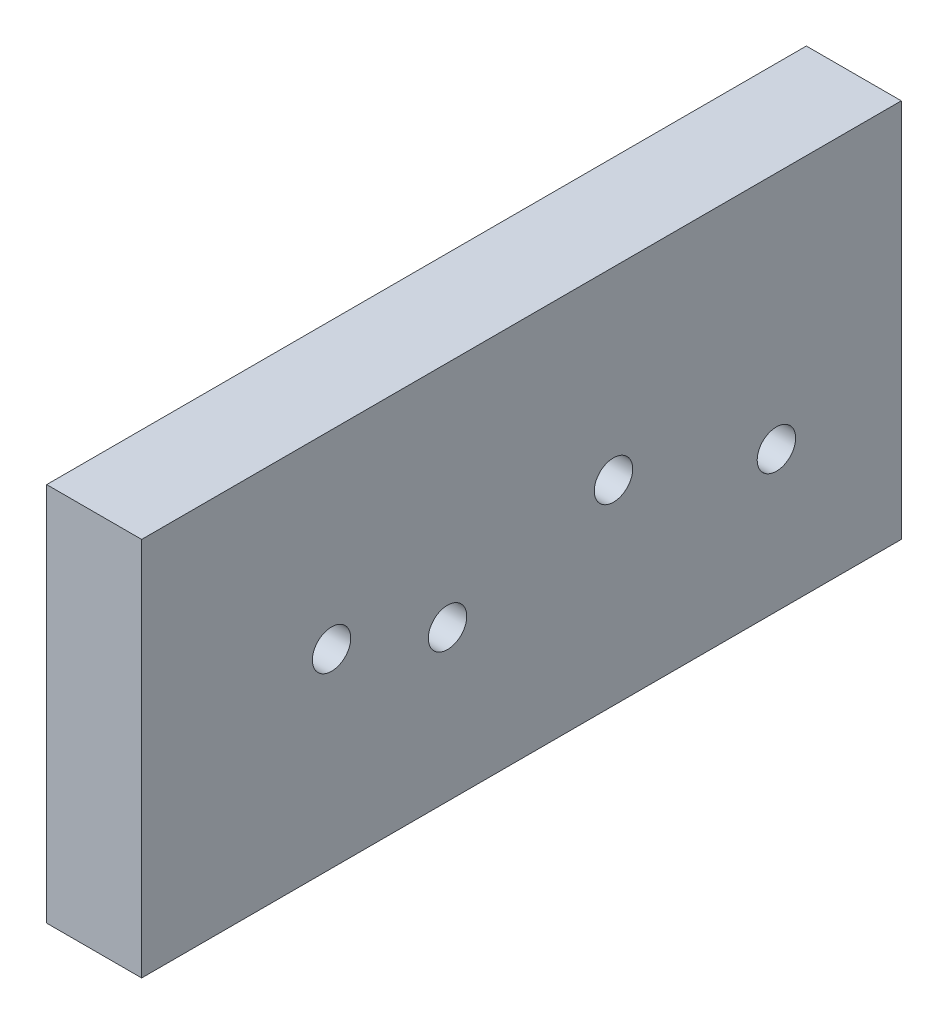
ISO-10303-21;
HEADER;
FILE_DESCRIPTION(('STEP AP214'),'2;1');
FILE_NAME('part.step','',(''),(''),'','','');
FILE_SCHEMA(('AUTOMOTIVE_DESIGN { 1 0 10303 214 1 1 1 1 }'));
ENDSEC;
DATA;
#1=APPLICATION_CONTEXT('core data for automotive mechanical design processes');
#2=APPLICATION_PROTOCOL_DEFINITION('international standard','automotive_design',2000,#1);
#3=PRODUCT_CONTEXT('',#1,'mechanical');
#4=PRODUCT('Part','Part','',(#3));
#5=PRODUCT_RELATED_PRODUCT_CATEGORY('part','',(#4));
#6=PRODUCT_DEFINITION_FORMATION('','',#4);
#7=PRODUCT_DEFINITION_CONTEXT('part definition',#1,'design');
#8=PRODUCT_DEFINITION('design','',#6,#7);
#9=PRODUCT_DEFINITION_SHAPE('','',#8);
#10=(LENGTH_UNIT() NAMED_UNIT(*) SI_UNIT(.MILLI.,.METRE.));
#11=(NAMED_UNIT(*) PLANE_ANGLE_UNIT() SI_UNIT($,.RADIAN.));
#12=(NAMED_UNIT(*) SI_UNIT($,.STERADIAN.) SOLID_ANGLE_UNIT());
#13=UNCERTAINTY_MEASURE_WITH_UNIT(LENGTH_MEASURE(1.E-05),#10,'distance_accuracy_value','');
#14=(GEOMETRIC_REPRESENTATION_CONTEXT(3) GLOBAL_UNCERTAINTY_ASSIGNED_CONTEXT((#13)) GLOBAL_UNIT_ASSIGNED_CONTEXT((#10,
#11,#12)) REPRESENTATION_CONTEXT('',''));
#15=CARTESIAN_POINT('',(0.,0.,0.));
#16=DIRECTION('',(0.,0.,1.));
#17=DIRECTION('',(1.,0.,0.));
#18=AXIS2_PLACEMENT_3D('',#15,#16,#17);
#19=CARTESIAN_POINT('',(19.05,-9.873506971,-51.1434579937716));
#20=DIRECTION('',(-1.,0.,0.));
#21=DIRECTION('',(0.,0.,1.));
#22=AXIS2_PLACEMENT_3D('',#19,#20,#21);
#23=CYLINDRICAL_SURFACE('',#22,3.85455777521835);
#24=CARTESIAN_POINT('',(19.05,-9.873506971,-51.1434579937716));
#25=DIRECTION('',(1.,0.,0.));
#26=DIRECTION('',(0.,0.,-1.));
#27=AXIS2_PLACEMENT_3D('',#24,#25,#26);
#28=CIRCLE('',#27,3.85455777521835);
#29=CARTESIAN_POINT('',(19.05,-9.873506971,-47.2889002185533));
#30=VERTEX_POINT('',#29);
#31=EDGE_CURVE('E165',#30,#30,#28,.T.);
#32=CARTESIAN_POINT('',(6.35,-9.873506971,-51.1434579937716));
#33=DIRECTION('',(-1.,0.,0.));
#34=DIRECTION('',(0.,0.,1.));
#35=AXIS2_PLACEMENT_3D('',#32,#33,#34);
#36=CIRCLE('',#35,3.85455777521835);
#37=CARTESIAN_POINT('',(6.35,-9.873506971,-47.2889002185533));
#38=VERTEX_POINT('',#37);
#39=EDGE_CURVE('E55',#38,#38,#36,.T.);
#40=CARTESIAN_POINT('',(19.05,-9.873506971,-47.2889002185533));
#41=CARTESIAN_POINT('',(18.9177083333333,-9.873506971,-47.2889002185533));
#42=CARTESIAN_POINT('',(18.7854166666667,-9.873506971,-47.2889002185533));
#43=CARTESIAN_POINT('',(18.5208333333333,-9.873506971,-47.2889002185533));
#44=CARTESIAN_POINT('',(18.3885416666667,-9.873506971,-47.2889002185533));
#45=CARTESIAN_POINT('',(18.1239583333333,-9.873506971,-47.2889002185533));
#46=CARTESIAN_POINT('',(17.9916666666667,-9.873506971,-47.2889002185533));
#47=CARTESIAN_POINT('',(17.7270833333333,-9.873506971,-47.2889002185533));
#48=CARTESIAN_POINT('',(17.5947916666667,-9.873506971,-47.2889002185533));
#49=CARTESIAN_POINT('',(17.3302083333333,-9.873506971,-47.2889002185533));
#50=CARTESIAN_POINT('',(17.1979166666667,-9.873506971,-47.2889002185533));
#51=CARTESIAN_POINT('',(16.9333333333333,-9.873506971,-47.2889002185533));
#52=CARTESIAN_POINT('',(16.8010416666667,-9.873506971,-47.2889002185533));
#53=CARTESIAN_POINT('',(16.5364583333333,-9.873506971,-47.2889002185533));
#54=CARTESIAN_POINT('',(16.4041666666667,-9.873506971,-47.2889002185533));
#55=CARTESIAN_POINT('',(16.1395833333333,-9.873506971,-47.2889002185533));
#56=CARTESIAN_POINT('',(16.0072916666667,-9.873506971,-47.2889002185533));
#57=CARTESIAN_POINT('',(15.7427083333333,-9.873506971,-47.2889002185533));
#58=CARTESIAN_POINT('',(15.6104166666667,-9.873506971,-47.2889002185533));
#59=CARTESIAN_POINT('',(15.3458333333333,-9.873506971,-47.2889002185533));
#60=CARTESIAN_POINT('',(15.2135416666667,-9.873506971,-47.2889002185533));
#61=CARTESIAN_POINT('',(14.9489583333333,-9.873506971,-47.2889002185533));
#62=CARTESIAN_POINT('',(14.8166666666667,-9.873506971,-47.2889002185533));
#63=CARTESIAN_POINT('',(14.5520833333333,-9.873506971,-47.2889002185533));
#64=CARTESIAN_POINT('',(14.4197916666667,-9.873506971,-47.2889002185533));
#65=CARTESIAN_POINT('',(14.1552083333333,-9.873506971,-47.2889002185533));
#66=CARTESIAN_POINT('',(14.0229166666667,-9.873506971,-47.2889002185533));
#67=CARTESIAN_POINT('',(13.7583333333333,-9.873506971,-47.2889002185533));
#68=CARTESIAN_POINT('',(13.6260416666667,-9.873506971,-47.2889002185533));
#69=CARTESIAN_POINT('',(13.3614583333333,-9.873506971,-47.2889002185533));
#70=CARTESIAN_POINT('',(13.2291666666667,-9.873506971,-47.2889002185533));
#71=CARTESIAN_POINT('',(12.9645833333333,-9.873506971,-47.2889002185533));
#72=CARTESIAN_POINT('',(12.8322916666667,-9.873506971,-47.2889002185533));
#73=CARTESIAN_POINT('',(12.5677083333333,-9.873506971,-47.2889002185533));
#74=CARTESIAN_POINT('',(12.4354166666667,-9.873506971,-47.2889002185533));
#75=CARTESIAN_POINT('',(12.1708333333333,-9.873506971,-47.2889002185533));
#76=CARTESIAN_POINT('',(12.0385416666667,-9.873506971,-47.2889002185533));
#77=CARTESIAN_POINT('',(11.7739583333333,-9.873506971,-47.2889002185533));
#78=CARTESIAN_POINT('',(11.6416666666667,-9.873506971,-47.2889002185533));
#79=CARTESIAN_POINT('',(11.3770833333333,-9.873506971,-47.2889002185533));
#80=CARTESIAN_POINT('',(11.2447916666667,-9.873506971,-47.2889002185533));
#81=CARTESIAN_POINT('',(10.9802083333333,-9.873506971,-47.2889002185533));
#82=CARTESIAN_POINT('',(10.8479166666667,-9.873506971,-47.2889002185533));
#83=CARTESIAN_POINT('',(10.5833333333333,-9.873506971,-47.2889002185533));
#84=CARTESIAN_POINT('',(10.4510416666667,-9.873506971,-47.2889002185533));
#85=CARTESIAN_POINT('',(10.1864583333333,-9.873506971,-47.2889002185533));
#86=CARTESIAN_POINT('',(10.0541666666667,-9.873506971,-47.2889002185533));
#87=CARTESIAN_POINT('',(9.78958333333333,-9.873506971,-47.2889002185533));
#88=CARTESIAN_POINT('',(9.65729166666667,-9.873506971,-47.2889002185533));
#89=CARTESIAN_POINT('',(9.39270833333333,-9.873506971,-47.2889002185533));
#90=CARTESIAN_POINT('',(9.26041666666667,-9.873506971,-47.2889002185533));
#91=CARTESIAN_POINT('',(8.99583333333333,-9.873506971,-47.2889002185533));
#92=CARTESIAN_POINT('',(8.86354166666667,-9.873506971,-47.2889002185533));
#93=CARTESIAN_POINT('',(8.59895833333333,-9.873506971,-47.2889002185533));
#94=CARTESIAN_POINT('',(8.46666666666667,-9.873506971,-47.2889002185533));
#95=CARTESIAN_POINT('',(8.20208333333333,-9.873506971,-47.2889002185533));
#96=CARTESIAN_POINT('',(8.06979166666667,-9.873506971,-47.2889002185533));
#97=CARTESIAN_POINT('',(7.80520833333333,-9.873506971,-47.2889002185533));
#98=CARTESIAN_POINT('',(7.67291666666667,-9.873506971,-47.2889002185533));
#99=CARTESIAN_POINT('',(7.40833333333333,-9.873506971,-47.2889002185533));
#100=CARTESIAN_POINT('',(7.27604166666667,-9.873506971,-47.2889002185533));
#101=CARTESIAN_POINT('',(7.01145833333333,-9.873506971,-47.2889002185533));
#102=CARTESIAN_POINT('',(6.87916666666667,-9.873506971,-47.2889002185533));
#103=CARTESIAN_POINT('',(6.61458333333333,-9.873506971,-47.2889002185533));
#104=CARTESIAN_POINT('',(6.48229166666667,-9.873506971,-47.2889002185533));
#105=CARTESIAN_POINT('',(6.35,-9.873506971,-47.2889002185533));
#106=B_SPLINE_CURVE_WITH_KNOTS('',3,(#40,#41,#42,#43,#44,#45,#46,#47,#48,#49,#50,#51,#52,#53,
#54,#55,#56,#57,#58,#59,#60,#61,#62,#63,#64,#65,#66,#67,#68,#69,#70,#71,#72,#73,#74,#75,#76,#77,
#78,#79,#80,#81,#82,#83,#84,#85,#86,#87,#88,#89,#90,#91,#92,#93,#94,#95,#96,#97,#98,#99,#100,
#101,#102,#103,#104,#105),.UNSPECIFIED.,.F.,.F.,(4,2,2,2,2,2,2,2,2,2,2,2,2,2,2,2,2,2,2,2,2,2,2,
2,2,2,2,2,2,2,2,2,4),(0.,0.396875000000001,0.793750000000003,1.190625,1.5875,1.984375,2.38125,
2.778125,3.175,3.571875,3.96875,4.365625,4.7625,5.159375,5.55625,5.953125,6.35,6.746875,7.14375,
7.540625,7.9375,8.334375,8.73125,9.128125,9.525,9.921875,10.31875,10.715625,11.1125,11.509375,
11.90625,12.303125,12.7),.UNSPECIFIED.);
#107=EDGE_CURVE('BSEAM51',#30,#38,#106,.T.);
#108=ORIENTED_EDGE('',*,*,#31,.T.);
#109=ORIENTED_EDGE('',*,*,#39,.T.);
#110=ORIENTED_EDGE('',*,*,#107,.T.);
#111=ORIENTED_EDGE('',*,*,#107,.F.);
#112=EDGE_LOOP('',(#108,#110,#109,#111));
#113=FACE_BOUND('',#112,.T.);
#114=ADVANCED_FACE('F51',(#113),#23,.F.);
#115=CARTESIAN_POINT('',(19.05,1.096077429,-18.4577335821185));
#116=DIRECTION('',(-1.,0.,0.));
#117=DIRECTION('',(0.,0.,1.));
#118=AXIS2_PLACEMENT_3D('',#115,#116,#117);
#119=CYLINDRICAL_SURFACE('',#118,3.85455777521835);
#120=CARTESIAN_POINT('',(19.05,1.096077429,-18.4577335821185));
#121=DIRECTION('',(1.,0.,0.));
#122=DIRECTION('',(0.,0.,-1.));
#123=AXIS2_PLACEMENT_3D('',#120,#121,#122);
#124=CIRCLE('',#123,3.85455777521835);
#125=CARTESIAN_POINT('',(19.05,1.096077429,-14.6031758069001));
#126=VERTEX_POINT('',#125);
#127=EDGE_CURVE('E161',#126,#126,#124,.T.);
#128=CARTESIAN_POINT('',(6.35,1.096077429,-18.4577335821185));
#129=DIRECTION('',(-1.,0.,0.));
#130=DIRECTION('',(0.,0.,1.));
#131=AXIS2_PLACEMENT_3D('',#128,#129,#130);
#132=CIRCLE('',#131,3.85455777521835);
#133=CARTESIAN_POINT('',(6.35,1.096077429,-14.6031758069001));
#134=VERTEX_POINT('',#133);
#135=EDGE_CURVE('E200',#134,#134,#132,.T.);
#136=CARTESIAN_POINT('',(19.05,1.096077429,-14.6031758069001));
#137=CARTESIAN_POINT('',(18.9177083333333,1.096077429,-14.6031758069001));
#138=CARTESIAN_POINT('',(18.7854166666667,1.096077429,-14.6031758069001));
#139=CARTESIAN_POINT('',(18.5208333333333,1.096077429,-14.6031758069001));
#140=CARTESIAN_POINT('',(18.3885416666667,1.096077429,-14.6031758069001));
#141=CARTESIAN_POINT('',(18.1239583333333,1.096077429,-14.6031758069001));
#142=CARTESIAN_POINT('',(17.9916666666667,1.096077429,-14.6031758069001));
#143=CARTESIAN_POINT('',(17.7270833333333,1.096077429,-14.6031758069001));
#144=CARTESIAN_POINT('',(17.5947916666667,1.096077429,-14.6031758069001));
#145=CARTESIAN_POINT('',(17.3302083333333,1.096077429,-14.6031758069001));
#146=CARTESIAN_POINT('',(17.1979166666667,1.096077429,-14.6031758069001));
#147=CARTESIAN_POINT('',(16.9333333333333,1.096077429,-14.6031758069001));
#148=CARTESIAN_POINT('',(16.8010416666667,1.096077429,-14.6031758069001));
#149=CARTESIAN_POINT('',(16.5364583333333,1.096077429,-14.6031758069001));
#150=CARTESIAN_POINT('',(16.4041666666667,1.096077429,-14.6031758069001));
#151=CARTESIAN_POINT('',(16.1395833333333,1.096077429,-14.6031758069001));
#152=CARTESIAN_POINT('',(16.0072916666667,1.096077429,-14.6031758069001));
#153=CARTESIAN_POINT('',(15.7427083333333,1.096077429,-14.6031758069001));
#154=CARTESIAN_POINT('',(15.6104166666667,1.096077429,-14.6031758069001));
#155=CARTESIAN_POINT('',(15.3458333333333,1.096077429,-14.6031758069001));
#156=CARTESIAN_POINT('',(15.2135416666667,1.096077429,-14.6031758069001));
#157=CARTESIAN_POINT('',(14.9489583333333,1.096077429,-14.6031758069001));
#158=CARTESIAN_POINT('',(14.8166666666667,1.096077429,-14.6031758069001));
#159=CARTESIAN_POINT('',(14.5520833333333,1.096077429,-14.6031758069001));
#160=CARTESIAN_POINT('',(14.4197916666667,1.096077429,-14.6031758069001));
#161=CARTESIAN_POINT('',(14.1552083333333,1.096077429,-14.6031758069001));
#162=CARTESIAN_POINT('',(14.0229166666667,1.096077429,-14.6031758069001));
#163=CARTESIAN_POINT('',(13.7583333333333,1.096077429,-14.6031758069001));
#164=CARTESIAN_POINT('',(13.6260416666667,1.096077429,-14.6031758069001));
#165=CARTESIAN_POINT('',(13.3614583333333,1.096077429,-14.6031758069001));
#166=CARTESIAN_POINT('',(13.2291666666667,1.096077429,-14.6031758069001));
#167=CARTESIAN_POINT('',(12.9645833333333,1.096077429,-14.6031758069001));
#168=CARTESIAN_POINT('',(12.8322916666667,1.096077429,-14.6031758069001));
#169=CARTESIAN_POINT('',(12.5677083333333,1.096077429,-14.6031758069001));
#170=CARTESIAN_POINT('',(12.4354166666667,1.096077429,-14.6031758069001));
#171=CARTESIAN_POINT('',(12.1708333333333,1.096077429,-14.6031758069001));
#172=CARTESIAN_POINT('',(12.0385416666667,1.096077429,-14.6031758069001));
#173=CARTESIAN_POINT('',(11.7739583333333,1.096077429,-14.6031758069001));
#174=CARTESIAN_POINT('',(11.6416666666667,1.096077429,-14.6031758069001));
#175=CARTESIAN_POINT('',(11.3770833333333,1.096077429,-14.6031758069001));
#176=CARTESIAN_POINT('',(11.2447916666667,1.096077429,-14.6031758069001));
#177=CARTESIAN_POINT('',(10.9802083333333,1.096077429,-14.6031758069001));
#178=CARTESIAN_POINT('',(10.8479166666667,1.096077429,-14.6031758069001));
#179=CARTESIAN_POINT('',(10.5833333333333,1.096077429,-14.6031758069001));
#180=CARTESIAN_POINT('',(10.4510416666667,1.096077429,-14.6031758069001));
#181=CARTESIAN_POINT('',(10.1864583333333,1.096077429,-14.6031758069001));
#182=CARTESIAN_POINT('',(10.0541666666667,1.096077429,-14.6031758069001));
#183=CARTESIAN_POINT('',(9.78958333333333,1.096077429,-14.6031758069001));
#184=CARTESIAN_POINT('',(9.65729166666667,1.096077429,-14.6031758069001));
#185=CARTESIAN_POINT('',(9.39270833333333,1.096077429,-14.6031758069001));
#186=CARTESIAN_POINT('',(9.26041666666667,1.096077429,-14.6031758069001));
#187=CARTESIAN_POINT('',(8.99583333333333,1.096077429,-14.6031758069001));
#188=CARTESIAN_POINT('',(8.86354166666667,1.096077429,-14.6031758069001));
#189=CARTESIAN_POINT('',(8.59895833333333,1.096077429,-14.6031758069001));
#190=CARTESIAN_POINT('',(8.46666666666667,1.096077429,-14.6031758069001));
#191=CARTESIAN_POINT('',(8.20208333333333,1.096077429,-14.6031758069001));
#192=CARTESIAN_POINT('',(8.06979166666667,1.096077429,-14.6031758069001));
#193=CARTESIAN_POINT('',(7.80520833333333,1.096077429,-14.6031758069001));
#194=CARTESIAN_POINT('',(7.67291666666667,1.096077429,-14.6031758069001));
#195=CARTESIAN_POINT('',(7.40833333333333,1.096077429,-14.6031758069001));
#196=CARTESIAN_POINT('',(7.27604166666667,1.096077429,-14.6031758069001));
#197=CARTESIAN_POINT('',(7.01145833333333,1.096077429,-14.6031758069001));
#198=CARTESIAN_POINT('',(6.87916666666667,1.096077429,-14.6031758069001));
#199=CARTESIAN_POINT('',(6.61458333333333,1.096077429,-14.6031758069001));
#200=CARTESIAN_POINT('',(6.48229166666667,1.096077429,-14.6031758069001));
#201=CARTESIAN_POINT('',(6.35,1.096077429,-14.6031758069001));
#202=B_SPLINE_CURVE_WITH_KNOTS('',3,(#136,#137,#138,#139,#140,#141,#142,#143,#144,#145,#146,
#147,#148,#149,#150,#151,#152,#153,#154,#155,#156,#157,#158,#159,#160,#161,#162,#163,#164,#165,
#166,#167,#168,#169,#170,#171,#172,#173,#174,#175,#176,#177,#178,#179,#180,#181,#182,#183,#184,
#185,#186,#187,#188,#189,#190,#191,#192,#193,#194,#195,#196,#197,#198,#199,#200,#201),
.UNSPECIFIED.,.F.,.F.,(4,2,2,2,2,2,2,2,2,2,2,2,2,2,2,2,2,2,2,2,2,2,2,2,2,2,2,2,2,2,2,2,4),(0.,
0.396875000000001,0.793750000000003,1.190625,1.5875,1.984375,2.38125,2.778125,3.175,3.571875,
3.96875,4.365625,4.7625,5.159375,5.55625,5.953125,6.35,6.746875,7.14375,7.540625,7.9375,
8.334375,8.73125,9.128125,9.525,9.921875,10.31875,10.715625,11.1125,11.509375,11.90625,
12.303125,12.7),.UNSPECIFIED.);
#203=EDGE_CURVE('BSEAM286',#126,#134,#202,.T.);
#204=ORIENTED_EDGE('',*,*,#127,.T.);
#205=ORIENTED_EDGE('',*,*,#135,.T.);
#206=ORIENTED_EDGE('',*,*,#203,.T.);
#207=ORIENTED_EDGE('',*,*,#203,.F.);
#208=EDGE_LOOP('',(#204,#206,#205,#207));
#209=FACE_BOUND('',#208,.T.);
#210=ADVANCED_FACE('F286',(#209),#119,.F.);
#211=CARTESIAN_POINT('',(19.05,0.,38.1));
#212=DIRECTION('',(-1.,0.,0.));
#213=DIRECTION('',(0.,0.,1.));
#214=AXIS2_PLACEMENT_3D('',#211,#212,#213);
#215=CYLINDRICAL_SURFACE('',#214,3.85455777521835);
#216=CARTESIAN_POINT('',(19.05,0.,38.1));
#217=DIRECTION('',(1.,0.,0.));
#218=DIRECTION('',(0.,0.,-1.));
#219=AXIS2_PLACEMENT_3D('',#216,#217,#218);
#220=CIRCLE('',#219,3.85455777521835);
#221=CARTESIAN_POINT('',(19.05,0.,41.9545577752184));
#222=VERTEX_POINT('',#221);
#223=EDGE_CURVE('E157',#222,#222,#220,.T.);
#224=CARTESIAN_POINT('',(6.35,0.,38.1));
#225=DIRECTION('',(-1.,0.,0.));
#226=DIRECTION('',(0.,0.,1.));
#227=AXIS2_PLACEMENT_3D('',#224,#225,#226);
#228=CIRCLE('',#227,3.85455777521835);
#229=CARTESIAN_POINT('',(6.35,0.,41.9545577752184));
#230=VERTEX_POINT('',#229);
#231=EDGE_CURVE('E196',#230,#230,#228,.T.);
#232=CARTESIAN_POINT('',(19.05,0.,41.9545577752184));
#233=CARTESIAN_POINT('',(18.9177083333333,0.,41.9545577752184));
#234=CARTESIAN_POINT('',(18.7854166666667,0.,41.9545577752184));
#235=CARTESIAN_POINT('',(18.5208333333333,0.,41.9545577752184));
#236=CARTESIAN_POINT('',(18.3885416666667,0.,41.9545577752184));
#237=CARTESIAN_POINT('',(18.1239583333333,0.,41.9545577752184));
#238=CARTESIAN_POINT('',(17.9916666666667,0.,41.9545577752184));
#239=CARTESIAN_POINT('',(17.7270833333333,0.,41.9545577752184));
#240=CARTESIAN_POINT('',(17.5947916666667,0.,41.9545577752184));
#241=CARTESIAN_POINT('',(17.3302083333333,0.,41.9545577752184));
#242=CARTESIAN_POINT('',(17.1979166666667,0.,41.9545577752184));
#243=CARTESIAN_POINT('',(16.9333333333333,0.,41.9545577752184));
#244=CARTESIAN_POINT('',(16.8010416666667,0.,41.9545577752184));
#245=CARTESIAN_POINT('',(16.5364583333333,0.,41.9545577752184));
#246=CARTESIAN_POINT('',(16.4041666666667,0.,41.9545577752184));
#247=CARTESIAN_POINT('',(16.1395833333333,0.,41.9545577752184));
#248=CARTESIAN_POINT('',(16.0072916666667,0.,41.9545577752184));
#249=CARTESIAN_POINT('',(15.7427083333333,0.,41.9545577752184));
#250=CARTESIAN_POINT('',(15.6104166666667,0.,41.9545577752184));
#251=CARTESIAN_POINT('',(15.3458333333333,0.,41.9545577752184));
#252=CARTESIAN_POINT('',(15.2135416666667,0.,41.9545577752184));
#253=CARTESIAN_POINT('',(14.9489583333333,0.,41.9545577752184));
#254=CARTESIAN_POINT('',(14.8166666666667,0.,41.9545577752184));
#255=CARTESIAN_POINT('',(14.5520833333333,0.,41.9545577752184));
#256=CARTESIAN_POINT('',(14.4197916666667,0.,41.9545577752184));
#257=CARTESIAN_POINT('',(14.1552083333333,0.,41.9545577752184));
#258=CARTESIAN_POINT('',(14.0229166666667,0.,41.9545577752184));
#259=CARTESIAN_POINT('',(13.7583333333333,0.,41.9545577752184));
#260=CARTESIAN_POINT('',(13.6260416666667,0.,41.9545577752184));
#261=CARTESIAN_POINT('',(13.3614583333333,0.,41.9545577752184));
#262=CARTESIAN_POINT('',(13.2291666666667,0.,41.9545577752184));
#263=CARTESIAN_POINT('',(12.9645833333333,0.,41.9545577752184));
#264=CARTESIAN_POINT('',(12.8322916666667,0.,41.9545577752184));
#265=CARTESIAN_POINT('',(12.5677083333333,0.,41.9545577752184));
#266=CARTESIAN_POINT('',(12.4354166666667,0.,41.9545577752184));
#267=CARTESIAN_POINT('',(12.1708333333333,0.,41.9545577752184));
#268=CARTESIAN_POINT('',(12.0385416666667,0.,41.9545577752184));
#269=CARTESIAN_POINT('',(11.7739583333333,0.,41.9545577752184));
#270=CARTESIAN_POINT('',(11.6416666666667,0.,41.9545577752184));
#271=CARTESIAN_POINT('',(11.3770833333333,0.,41.9545577752184));
#272=CARTESIAN_POINT('',(11.2447916666667,0.,41.9545577752184));
#273=CARTESIAN_POINT('',(10.9802083333333,0.,41.9545577752184));
#274=CARTESIAN_POINT('',(10.8479166666667,0.,41.9545577752184));
#275=CARTESIAN_POINT('',(10.5833333333333,0.,41.9545577752184));
#276=CARTESIAN_POINT('',(10.4510416666667,0.,41.9545577752184));
#277=CARTESIAN_POINT('',(10.1864583333333,0.,41.9545577752184));
#278=CARTESIAN_POINT('',(10.0541666666667,0.,41.9545577752184));
#279=CARTESIAN_POINT('',(9.78958333333333,0.,41.9545577752184));
#280=CARTESIAN_POINT('',(9.65729166666667,0.,41.9545577752184));
#281=CARTESIAN_POINT('',(9.39270833333333,0.,41.9545577752184));
#282=CARTESIAN_POINT('',(9.26041666666667,0.,41.9545577752184));
#283=CARTESIAN_POINT('',(8.99583333333333,0.,41.9545577752184));
#284=CARTESIAN_POINT('',(8.86354166666667,0.,41.9545577752184));
#285=CARTESIAN_POINT('',(8.59895833333333,0.,41.9545577752184));
#286=CARTESIAN_POINT('',(8.46666666666667,0.,41.9545577752184));
#287=CARTESIAN_POINT('',(8.20208333333333,0.,41.9545577752184));
#288=CARTESIAN_POINT('',(8.06979166666667,0.,41.9545577752184));
#289=CARTESIAN_POINT('',(7.80520833333333,0.,41.9545577752184));
#290=CARTESIAN_POINT('',(7.67291666666667,0.,41.9545577752184));
#291=CARTESIAN_POINT('',(7.40833333333333,0.,41.9545577752184));
#292=CARTESIAN_POINT('',(7.27604166666667,0.,41.9545577752184));
#293=CARTESIAN_POINT('',(7.01145833333333,0.,41.9545577752184));
#294=CARTESIAN_POINT('',(6.87916666666667,0.,41.9545577752184));
#295=CARTESIAN_POINT('',(6.61458333333333,0.,41.9545577752184));
#296=CARTESIAN_POINT('',(6.48229166666667,0.,41.9545577752184));
#297=CARTESIAN_POINT('',(6.35,0.,41.9545577752184));
#298=B_SPLINE_CURVE_WITH_KNOTS('',3,(#232,#233,#234,#235,#236,#237,#238,#239,#240,#241,#242,
#243,#244,#245,#246,#247,#248,#249,#250,#251,#252,#253,#254,#255,#256,#257,#258,#259,#260,#261,
#262,#263,#264,#265,#266,#267,#268,#269,#270,#271,#272,#273,#274,#275,#276,#277,#278,#279,#280,
#281,#282,#283,#284,#285,#286,#287,#288,#289,#290,#291,#292,#293,#294,#295,#296,#297),
.UNSPECIFIED.,.F.,.F.,(4,2,2,2,2,2,2,2,2,2,2,2,2,2,2,2,2,2,2,2,2,2,2,2,2,2,2,2,2,2,2,2,4),(0.,
0.396875000000001,0.793750000000003,1.190625,1.5875,1.984375,2.38125,2.778125,3.175,3.571875,
3.96875,4.365625,4.7625,5.159375,5.55625,5.953125,6.35,6.746875,7.14375,7.540625,7.9375,
8.334375,8.73125,9.128125,9.525,9.921875,10.31875,10.715625,11.1125,11.509375,11.90625,
12.303125,12.7),.UNSPECIFIED.);
#299=EDGE_CURVE('BSEAM293',#222,#230,#298,.T.);
#300=ORIENTED_EDGE('',*,*,#223,.T.);
#301=ORIENTED_EDGE('',*,*,#231,.T.);
#302=ORIENTED_EDGE('',*,*,#299,.T.);
#303=ORIENTED_EDGE('',*,*,#299,.F.);
#304=EDGE_LOOP('',(#300,#302,#301,#303));
#305=FACE_BOUND('',#304,.T.);
#306=ADVANCED_FACE('F293',(#305),#215,.F.);
#307=CARTESIAN_POINT('',(19.05,-7.860160654,14.8360220129459));
#308=DIRECTION('',(-1.,0.,0.));
#309=DIRECTION('',(0.,0.,1.));
#310=AXIS2_PLACEMENT_3D('',#307,#308,#309);
#311=CYLINDRICAL_SURFACE('',#310,3.85455777521835);
#312=CARTESIAN_POINT('',(19.05,-7.860160654,14.8360220129459));
#313=DIRECTION('',(1.,0.,0.));
#314=DIRECTION('',(0.,0.,-1.));
#315=AXIS2_PLACEMENT_3D('',#312,#313,#314);
#316=CIRCLE('',#315,3.85455777521835);
#317=CARTESIAN_POINT('',(19.05,-7.860160654,18.6905797881643));
#318=VERTEX_POINT('',#317);
#319=EDGE_CURVE('E169',#318,#318,#316,.T.);
#320=CARTESIAN_POINT('',(6.35,-7.860160654,14.8360220129459));
#321=DIRECTION('',(-1.,0.,0.));
#322=DIRECTION('',(0.,0.,1.));
#323=AXIS2_PLACEMENT_3D('',#320,#321,#322);
#324=CIRCLE('',#323,3.85455777521835);
#325=CARTESIAN_POINT('',(6.35,-7.860160654,18.6905797881643));
#326=VERTEX_POINT('',#325);
#327=EDGE_CURVE('E192',#326,#326,#324,.T.);
#328=CARTESIAN_POINT('',(19.05,-7.860160654,18.6905797881643));
#329=CARTESIAN_POINT('',(18.9177083333333,-7.860160654,18.6905797881643));
#330=CARTESIAN_POINT('',(18.7854166666667,-7.860160654,18.6905797881643));
#331=CARTESIAN_POINT('',(18.5208333333333,-7.860160654,18.6905797881643));
#332=CARTESIAN_POINT('',(18.3885416666667,-7.860160654,18.6905797881643));
#333=CARTESIAN_POINT('',(18.1239583333333,-7.860160654,18.6905797881643));
#334=CARTESIAN_POINT('',(17.9916666666667,-7.860160654,18.6905797881643));
#335=CARTESIAN_POINT('',(17.7270833333333,-7.860160654,18.6905797881643));
#336=CARTESIAN_POINT('',(17.5947916666667,-7.860160654,18.6905797881643));
#337=CARTESIAN_POINT('',(17.3302083333333,-7.860160654,18.6905797881643));
#338=CARTESIAN_POINT('',(17.1979166666667,-7.860160654,18.6905797881643));
#339=CARTESIAN_POINT('',(16.9333333333333,-7.860160654,18.6905797881643));
#340=CARTESIAN_POINT('',(16.8010416666667,-7.860160654,18.6905797881643));
#341=CARTESIAN_POINT('',(16.5364583333333,-7.860160654,18.6905797881643));
#342=CARTESIAN_POINT('',(16.4041666666667,-7.860160654,18.6905797881643));
#343=CARTESIAN_POINT('',(16.1395833333333,-7.860160654,18.6905797881643));
#344=CARTESIAN_POINT('',(16.0072916666667,-7.860160654,18.6905797881643));
#345=CARTESIAN_POINT('',(15.7427083333333,-7.860160654,18.6905797881643));
#346=CARTESIAN_POINT('',(15.6104166666667,-7.860160654,18.6905797881643));
#347=CARTESIAN_POINT('',(15.3458333333333,-7.860160654,18.6905797881643));
#348=CARTESIAN_POINT('',(15.2135416666667,-7.860160654,18.6905797881643));
#349=CARTESIAN_POINT('',(14.9489583333333,-7.860160654,18.6905797881643));
#350=CARTESIAN_POINT('',(14.8166666666667,-7.860160654,18.6905797881643));
#351=CARTESIAN_POINT('',(14.5520833333333,-7.860160654,18.6905797881643));
#352=CARTESIAN_POINT('',(14.4197916666667,-7.860160654,18.6905797881643));
#353=CARTESIAN_POINT('',(14.1552083333333,-7.860160654,18.6905797881643));
#354=CARTESIAN_POINT('',(14.0229166666667,-7.860160654,18.6905797881643));
#355=CARTESIAN_POINT('',(13.7583333333333,-7.860160654,18.6905797881643));
#356=CARTESIAN_POINT('',(13.6260416666667,-7.860160654,18.6905797881643));
#357=CARTESIAN_POINT('',(13.3614583333333,-7.860160654,18.6905797881643));
#358=CARTESIAN_POINT('',(13.2291666666667,-7.860160654,18.6905797881643));
#359=CARTESIAN_POINT('',(12.9645833333333,-7.860160654,18.6905797881643));
#360=CARTESIAN_POINT('',(12.8322916666667,-7.860160654,18.6905797881643));
#361=CARTESIAN_POINT('',(12.5677083333333,-7.860160654,18.6905797881643));
#362=CARTESIAN_POINT('',(12.4354166666667,-7.860160654,18.6905797881643));
#363=CARTESIAN_POINT('',(12.1708333333333,-7.860160654,18.6905797881643));
#364=CARTESIAN_POINT('',(12.0385416666667,-7.860160654,18.6905797881643));
#365=CARTESIAN_POINT('',(11.7739583333333,-7.860160654,18.6905797881643));
#366=CARTESIAN_POINT('',(11.6416666666667,-7.860160654,18.6905797881643));
#367=CARTESIAN_POINT('',(11.3770833333333,-7.860160654,18.6905797881643));
#368=CARTESIAN_POINT('',(11.2447916666667,-7.860160654,18.6905797881643));
#369=CARTESIAN_POINT('',(10.9802083333333,-7.860160654,18.6905797881643));
#370=CARTESIAN_POINT('',(10.8479166666667,-7.860160654,18.6905797881643));
#371=CARTESIAN_POINT('',(10.5833333333333,-7.860160654,18.6905797881643));
#372=CARTESIAN_POINT('',(10.4510416666667,-7.860160654,18.6905797881643));
#373=CARTESIAN_POINT('',(10.1864583333333,-7.860160654,18.6905797881643));
#374=CARTESIAN_POINT('',(10.0541666666667,-7.860160654,18.6905797881643));
#375=CARTESIAN_POINT('',(9.78958333333333,-7.860160654,18.6905797881643));
#376=CARTESIAN_POINT('',(9.65729166666667,-7.860160654,18.6905797881643));
#377=CARTESIAN_POINT('',(9.39270833333333,-7.860160654,18.6905797881643));
#378=CARTESIAN_POINT('',(9.26041666666667,-7.860160654,18.6905797881643));
#379=CARTESIAN_POINT('',(8.99583333333333,-7.860160654,18.6905797881643));
#380=CARTESIAN_POINT('',(8.86354166666667,-7.860160654,18.6905797881643));
#381=CARTESIAN_POINT('',(8.59895833333333,-7.860160654,18.6905797881643));
#382=CARTESIAN_POINT('',(8.46666666666667,-7.860160654,18.6905797881643));
#383=CARTESIAN_POINT('',(8.20208333333333,-7.860160654,18.6905797881643));
#384=CARTESIAN_POINT('',(8.06979166666667,-7.860160654,18.6905797881643));
#385=CARTESIAN_POINT('',(7.80520833333333,-7.860160654,18.6905797881643));
#386=CARTESIAN_POINT('',(7.67291666666667,-7.860160654,18.6905797881643));
#387=CARTESIAN_POINT('',(7.40833333333333,-7.860160654,18.6905797881643));
#388=CARTESIAN_POINT('',(7.27604166666667,-7.860160654,18.6905797881643));
#389=CARTESIAN_POINT('',(7.01145833333333,-7.860160654,18.6905797881643));
#390=CARTESIAN_POINT('',(6.87916666666667,-7.860160654,18.6905797881643));
#391=CARTESIAN_POINT('',(6.61458333333333,-7.860160654,18.6905797881643));
#392=CARTESIAN_POINT('',(6.48229166666667,-7.860160654,18.6905797881643));
#393=CARTESIAN_POINT('',(6.35,-7.860160654,18.6905797881643));
#394=B_SPLINE_CURVE_WITH_KNOTS('',3,(#328,#329,#330,#331,#332,#333,#334,#335,#336,#337,#338,
#339,#340,#341,#342,#343,#344,#345,#346,#347,#348,#349,#350,#351,#352,#353,#354,#355,#356,#357,
#358,#359,#360,#361,#362,#363,#364,#365,#366,#367,#368,#369,#370,#371,#372,#373,#374,#375,#376,
#377,#378,#379,#380,#381,#382,#383,#384,#385,#386,#387,#388,#389,#390,#391,#392,#393),
.UNSPECIFIED.,.F.,.F.,(4,2,2,2,2,2,2,2,2,2,2,2,2,2,2,2,2,2,2,2,2,2,2,2,2,2,2,2,2,2,2,2,4),(0.,
0.396875000000001,0.793750000000003,1.190625,1.5875,1.984375,2.38125,2.778125,3.175,3.571875,
3.96875,4.365625,4.7625,5.159375,5.55625,5.953125,6.35,6.746875,7.14375,7.540625,7.9375,
8.334375,8.73125,9.128125,9.525,9.921875,10.31875,10.715625,11.1125,11.509375,11.90625,
12.303125,12.7),.UNSPECIFIED.);
#395=EDGE_CURVE('BSEAM297',#318,#326,#394,.T.);
#396=ORIENTED_EDGE('',*,*,#319,.T.);
#397=ORIENTED_EDGE('',*,*,#327,.T.);
#398=ORIENTED_EDGE('',*,*,#395,.T.);
#399=ORIENTED_EDGE('',*,*,#395,.F.);
#400=EDGE_LOOP('',(#396,#398,#397,#399));
#401=FACE_BOUND('',#400,.T.);
#402=ADVANCED_FACE('F297',(#401),#311,.F.);
#403=CARTESIAN_POINT('',(19.05,-38.1,0.));
#404=DIRECTION('',(0.,1.,0.));
#405=DIRECTION('',(0.,0.,1.));
#406=AXIS2_PLACEMENT_3D('',#403,#404,#405);
#407=PLANE('',#406);
#408=CARTESIAN_POINT('',(9.52500000000002,-38.1,-63.5));
#409=DIRECTION('',(0.,-1.,0.));
#410=DIRECTION('',(0.,0.,-1.));
#411=AXIS2_PLACEMENT_3D('',#408,#409,#410);
#412=CIRCLE('',#411,3.17499999999999);
#413=CARTESIAN_POINT('',(9.52500000000002,-38.1,-66.675));
#414=VERTEX_POINT('',#413);
#415=EDGE_CURVE('E121',#414,#414,#412,.T.);
#416=ORIENTED_EDGE('',*,*,#415,.F.);
#417=EDGE_LOOP('',(#416));
#418=FACE_BOUND('',#417,.T.);
#419=CARTESIAN_POINT('',(9.525,-38.1,0.));
#420=DIRECTION('',(0.,-1.,0.));
#421=DIRECTION('',(0.,0.,-1.));
#422=AXIS2_PLACEMENT_3D('',#419,#420,#421);
#423=CIRCLE('',#422,3.17499999999999);
#424=CARTESIAN_POINT('',(9.525,-38.1,-3.17499999999997));
#425=VERTEX_POINT('',#424);
#426=EDGE_CURVE('E120',#425,#425,#423,.T.);
#427=ORIENTED_EDGE('',*,*,#426,.F.);
#428=EDGE_LOOP('',(#427));
#429=FACE_BOUND('',#428,.T.);
#430=CARTESIAN_POINT('',(9.525,-38.1,57.15));
#431=DIRECTION('',(0.,-1.,0.));
#432=DIRECTION('',(0.,0.,-1.));
#433=AXIS2_PLACEMENT_3D('',#430,#431,#432);
#434=CIRCLE('',#433,3.17499999999999);
#435=CARTESIAN_POINT('',(9.525,-38.1,53.975));
#436=VERTEX_POINT('',#435);
#437=EDGE_CURVE('E135',#436,#436,#434,.T.);
#438=ORIENTED_EDGE('',*,*,#437,.F.);
#439=EDGE_LOOP('',(#438));
#440=FACE_BOUND('',#439,.T.);
#441=DIRECTION('',(0.,0.,-1.));
#442=VECTOR('',#441,1.);
#443=CARTESIAN_POINT('',(0.,-38.1,0.));
#444=LINE('',#443,#442);
#445=CARTESIAN_POINT('',(0.,-38.1,76.2));
#446=VERTEX_POINT('',#445);
#447=CARTESIAN_POINT('',(0.,-38.1,-76.2));
#448=VERTEX_POINT('',#447);
#449=EDGE_CURVE('E143',#446,#448,#444,.T.);
#450=ORIENTED_EDGE('',*,*,#449,.T.);
#451=DIRECTION('',(-1.,0.,0.));
#452=VECTOR('',#451,1.);
#453=CARTESIAN_POINT('',(19.05,-38.1,-76.2));
#454=LINE('',#453,#452);
#455=CARTESIAN_POINT('',(19.05,-38.1,-76.2));
#456=VERTEX_POINT('',#455);
#457=EDGE_CURVE('E11',#456,#448,#454,.T.);
#458=ORIENTED_EDGE('',*,*,#457,.F.);
#459=DIRECTION('',(0.,0.,-1.));
#460=VECTOR('',#459,1.);
#461=CARTESIAN_POINT('',(19.05,-38.1,0.));
#462=LINE('',#461,#460);
#463=CARTESIAN_POINT('',(19.05,-38.1,76.2));
#464=VERTEX_POINT('',#463);
#465=EDGE_CURVE('E144',#464,#456,#462,.T.);
#466=ORIENTED_EDGE('',*,*,#465,.F.);
#467=DIRECTION('',(-1.,0.,0.));
#468=VECTOR('',#467,1.);
#469=CARTESIAN_POINT('',(19.05,-38.1,76.2));
#470=LINE('',#469,#468);
#471=EDGE_CURVE('E71',#464,#446,#470,.T.);
#472=ORIENTED_EDGE('',*,*,#471,.T.);
#473=EDGE_LOOP('',(#450,#458,#466,#472));
#474=FACE_BOUND('',#473,.T.);
#475=ADVANCED_FACE('F53',(#418,#429,#440,#474),#407,.F.);
#476=CARTESIAN_POINT('',(19.05,0.,-76.2));
#477=DIRECTION('',(0.,0.,1.));
#478=DIRECTION('',(1.,0.,0.));
#479=AXIS2_PLACEMENT_3D('',#476,#477,#478);
#480=PLANE('',#479);
#481=DIRECTION('',(0.,1.,0.));
#482=VECTOR('',#481,1.);
#483=CARTESIAN_POINT('',(0.,0.,-76.2));
#484=LINE('',#483,#482);
#485=CARTESIAN_POINT('',(0.,38.1,-76.2));
#486=VERTEX_POINT('',#485);
#487=EDGE_CURVE('E175',#448,#486,#484,.T.);
#488=ORIENTED_EDGE('',*,*,#487,.T.);
#489=DIRECTION('',(-1.,0.,0.));
#490=VECTOR('',#489,1.);
#491=CARTESIAN_POINT('',(19.05,38.1,-76.2));
#492=LINE('',#491,#490);
#493=CARTESIAN_POINT('',(19.05,38.1,-76.2));
#494=VERTEX_POINT('',#493);
#495=EDGE_CURVE('E62',#494,#486,#492,.T.);
#496=ORIENTED_EDGE('',*,*,#495,.F.);
#497=DIRECTION('',(0.,1.,0.));
#498=VECTOR('',#497,1.);
#499=CARTESIAN_POINT('',(19.05,0.,-76.2));
#500=LINE('',#499,#498);
#501=EDGE_CURVE('E98',#456,#494,#500,.T.);
#502=ORIENTED_EDGE('',*,*,#501,.F.);
#503=ORIENTED_EDGE('',*,*,#457,.T.);
#504=EDGE_LOOP('',(#488,#496,#502,#503));
#505=FACE_BOUND('',#504,.T.);
#506=ADVANCED_FACE('F281',(#505),#480,.F.);
#507=CARTESIAN_POINT('',(19.05,38.1,0.));
#508=DIRECTION('',(0.,1.,0.));
#509=DIRECTION('',(0.,0.,1.));
#510=AXIS2_PLACEMENT_3D('',#507,#508,#509);
#511=PLANE('',#510);
#512=DIRECTION('',(0.,0.,-1.));
#513=VECTOR('',#512,1.);
#514=CARTESIAN_POINT('',(0.,38.1,0.));
#515=LINE('',#514,#513);
#516=CARTESIAN_POINT('',(0.,38.1,76.2));
#517=VERTEX_POINT('',#516);
#518=EDGE_CURVE('E179',#517,#486,#515,.T.);
#519=ORIENTED_EDGE('',*,*,#518,.F.);
#520=DIRECTION('',(-1.,0.,0.));
#521=VECTOR('',#520,1.);
#522=CARTESIAN_POINT('',(19.05,38.1,76.2));
#523=LINE('',#522,#521);
#524=CARTESIAN_POINT('',(19.05,38.1,76.2));
#525=VERTEX_POINT('',#524);
#526=EDGE_CURVE('E87',#525,#517,#523,.T.);
#527=ORIENTED_EDGE('',*,*,#526,.F.);
#528=DIRECTION('',(0.,0.,-1.));
#529=VECTOR('',#528,1.);
#530=CARTESIAN_POINT('',(19.05,38.1,0.));
#531=LINE('',#530,#529);
#532=EDGE_CURVE('E150',#525,#494,#531,.T.);
#533=ORIENTED_EDGE('',*,*,#532,.T.);
#534=ORIENTED_EDGE('',*,*,#495,.T.);
#535=EDGE_LOOP('',(#519,#527,#533,#534));
#536=FACE_BOUND('',#535,.T.);
#537=ADVANCED_FACE('F274',(#536),#511,.T.);
#538=CARTESIAN_POINT('',(19.05,0.,76.2));
#539=DIRECTION('',(0.,0.,1.));
#540=DIRECTION('',(1.,0.,0.));
#541=AXIS2_PLACEMENT_3D('',#538,#539,#540);
#542=PLANE('',#541);
#543=DIRECTION('',(0.,1.,0.));
#544=VECTOR('',#543,1.);
#545=CARTESIAN_POINT('',(0.,0.,76.2));
#546=LINE('',#545,#544);
#547=EDGE_CURVE('E147',#446,#517,#546,.T.);
#548=ORIENTED_EDGE('',*,*,#547,.F.);
#549=ORIENTED_EDGE('',*,*,#471,.F.);
#550=DIRECTION('',(0.,1.,0.));
#551=VECTOR('',#550,1.);
#552=CARTESIAN_POINT('',(19.05,0.,76.2));
#553=LINE('',#552,#551);
#554=EDGE_CURVE('E154',#464,#525,#553,.T.);
#555=ORIENTED_EDGE('',*,*,#554,.T.);
#556=ORIENTED_EDGE('',*,*,#526,.T.);
#557=EDGE_LOOP('',(#548,#549,#555,#556));
#558=FACE_BOUND('',#557,.T.);
#559=ADVANCED_FACE('F272',(#558),#542,.T.);
#560=CARTESIAN_POINT('',(19.05,0.,0.));
#561=DIRECTION('',(1.,0.,0.));
#562=DIRECTION('',(0.,0.,-1.));
#563=AXIS2_PLACEMENT_3D('',#560,#561,#562);
#564=PLANE('',#563);
#565=ORIENTED_EDGE('',*,*,#465,.T.);
#566=ORIENTED_EDGE('',*,*,#501,.T.);
#567=ORIENTED_EDGE('',*,*,#532,.F.);
#568=ORIENTED_EDGE('',*,*,#554,.F.);
#569=EDGE_LOOP('',(#565,#566,#567,#568));
#570=FACE_BOUND('',#569,.T.);
#571=ORIENTED_EDGE('',*,*,#223,.F.);
#572=EDGE_LOOP('',(#571));
#573=FACE_BOUND('',#572,.T.);
#574=ORIENTED_EDGE('',*,*,#127,.F.);
#575=EDGE_LOOP('',(#574));
#576=FACE_BOUND('',#575,.T.);
#577=ORIENTED_EDGE('',*,*,#31,.F.);
#578=EDGE_LOOP('',(#577));
#579=FACE_BOUND('',#578,.T.);
#580=ORIENTED_EDGE('',*,*,#319,.F.);
#581=EDGE_LOOP('',(#580));
#582=FACE_BOUND('',#581,.T.);
#583=ADVANCED_FACE('F263',(#570,#573,#576,#579,#582),#564,.T.);
#584=CARTESIAN_POINT('',(0.,0.,0.));
#585=DIRECTION('',(1.,0.,0.));
#586=DIRECTION('',(0.,0.,-1.));
#587=AXIS2_PLACEMENT_3D('',#584,#585,#586);
#588=PLANE('',#587);
#589=CARTESIAN_POINT('',(0.,0.,38.1));
#590=DIRECTION('',(-1.,0.,0.));
#591=DIRECTION('',(0.,0.,1.));
#592=AXIS2_PLACEMENT_3D('',#589,#590,#591);
#593=CIRCLE('',#592,4.7625);
#594=CARTESIAN_POINT('',(0.,0.,42.8625));
#595=VERTEX_POINT('',#594);
#596=EDGE_CURVE('E242',#595,#595,#593,.T.);
#597=ORIENTED_EDGE('',*,*,#596,.F.);
#598=EDGE_LOOP('',(#597));
#599=FACE_BOUND('',#598,.T.);
#600=CARTESIAN_POINT('',(0.,-7.860160654,14.8360220129459));
#601=DIRECTION('',(-1.,0.,0.));
#602=DIRECTION('',(0.,0.,1.));
#603=AXIS2_PLACEMENT_3D('',#600,#601,#602);
#604=CIRCLE('',#603,4.7625);
#605=CARTESIAN_POINT('',(0.,-7.860160654,19.5985220129459));
#606=VERTEX_POINT('',#605);
#607=EDGE_CURVE('E238',#606,#606,#604,.T.);
#608=ORIENTED_EDGE('',*,*,#607,.F.);
#609=EDGE_LOOP('',(#608));
#610=FACE_BOUND('',#609,.T.);
#611=CARTESIAN_POINT('',(0.,1.096077429,-18.4577335821185));
#612=DIRECTION('',(-1.,0.,0.));
#613=DIRECTION('',(0.,0.,1.));
#614=AXIS2_PLACEMENT_3D('',#611,#612,#613);
#615=CIRCLE('',#614,4.7625);
#616=CARTESIAN_POINT('',(0.,1.096077429,-13.6952335821185));
#617=VERTEX_POINT('',#616);
#618=EDGE_CURVE('E230',#617,#617,#615,.T.);
#619=ORIENTED_EDGE('',*,*,#618,.F.);
#620=EDGE_LOOP('',(#619));
#621=FACE_BOUND('',#620,.T.);
#622=CARTESIAN_POINT('',(0.,-9.873506971,-51.1434579937716));
#623=DIRECTION('',(-1.,0.,0.));
#624=DIRECTION('',(0.,0.,1.));
#625=AXIS2_PLACEMENT_3D('',#622,#623,#624);
#626=CIRCLE('',#625,4.7625);
#627=CARTESIAN_POINT('',(0.,-9.873506971,-46.3809579937716));
#628=VERTEX_POINT('',#627);
#629=EDGE_CURVE('E221',#628,#628,#626,.T.);
#630=ORIENTED_EDGE('',*,*,#629,.F.);
#631=EDGE_LOOP('',(#630));
#632=FACE_BOUND('',#631,.T.);
#633=ORIENTED_EDGE('',*,*,#449,.F.);
#634=ORIENTED_EDGE('',*,*,#547,.T.);
#635=ORIENTED_EDGE('',*,*,#518,.T.);
#636=ORIENTED_EDGE('',*,*,#487,.F.);
#637=EDGE_LOOP('',(#633,#634,#635,#636));
#638=FACE_BOUND('',#637,.T.);
#639=ADVANCED_FACE('F259',(#599,#610,#621,#632,#638),#588,.F.);
#640=CARTESIAN_POINT('',(9.525,-25.4,57.15));
#641=DIRECTION('',(0.,-1.,0.));
#642=DIRECTION('',(0.,0.,-1.));
#643=AXIS2_PLACEMENT_3D('',#640,#641,#642);
#644=CONICAL_SURFACE('',#643,3.17499999999999,1.02974425867665);
#645=CARTESIAN_POINT('',(9.525,-23.4922675345875,57.15));
#646=VERTEX_POINT('',#645);
#647=VERTEX_LOOP('',#646);
#648=FACE_BOUND('',#647,.T.);
#649=CARTESIAN_POINT('',(9.525,-25.4,57.15));
#650=DIRECTION('',(0.,-1.,0.));
#651=DIRECTION('',(0.,0.,-1.));
#652=AXIS2_PLACEMENT_3D('',#649,#650,#651);
#653=CIRCLE('',#652,3.17499999999999);
#654=CARTESIAN_POINT('',(9.525,-25.4,53.975));
#655=VERTEX_POINT('',#654);
#656=EDGE_CURVE('E139',#655,#655,#653,.T.);
#657=ORIENTED_EDGE('',*,*,#656,.T.);
#658=EDGE_LOOP('',(#657));
#659=FACE_BOUND('',#658,.T.);
#660=ADVANCED_FACE('F262',(#648,#659),#644,.F.);
#661=CARTESIAN_POINT('',(9.525,-38.1,57.15));
#662=DIRECTION('',(0.,-1.,0.));
#663=DIRECTION('',(0.,0.,-1.));
#664=AXIS2_PLACEMENT_3D('',#661,#662,#663);
#665=CYLINDRICAL_SURFACE('',#664,3.17499999999999);
#666=ORIENTED_EDGE('',*,*,#656,.F.);
#667=EDGE_LOOP('',(#666));
#668=FACE_BOUND('',#667,.T.);
#669=ORIENTED_EDGE('',*,*,#437,.T.);
#670=EDGE_LOOP('',(#669));
#671=FACE_BOUND('',#670,.T.);
#672=ADVANCED_FACE('F336',(#668,#671),#665,.F.);
#673=CARTESIAN_POINT('',(9.525,-25.4,0.));
#674=DIRECTION('',(0.,-1.,0.));
#675=DIRECTION('',(0.,0.,-1.));
#676=AXIS2_PLACEMENT_3D('',#673,#674,#675);
#677=CONICAL_SURFACE('',#676,3.17499999999999,1.02974425867665);
#678=CARTESIAN_POINT('',(9.525,-23.4922675345875,0.));
#679=VERTEX_POINT('',#678);
#680=VERTEX_LOOP('',#679);
#681=FACE_BOUND('',#680,.T.);
#682=CARTESIAN_POINT('',(9.525,-25.4,0.));
#683=DIRECTION('',(0.,-1.,0.));
#684=DIRECTION('',(0.,0.,-1.));
#685=AXIS2_PLACEMENT_3D('',#682,#683,#684);
#686=CIRCLE('',#685,3.17499999999999);
#687=CARTESIAN_POINT('',(9.525,-25.4,-3.17499999999997));
#688=VERTEX_POINT('',#687);
#689=EDGE_CURVE('E126',#688,#688,#686,.T.);
#690=ORIENTED_EDGE('',*,*,#689,.T.);
#691=EDGE_LOOP('',(#690));
#692=FACE_BOUND('',#691,.T.);
#693=ADVANCED_FACE('F332',(#681,#692),#677,.F.);
#694=CARTESIAN_POINT('',(9.525,-38.1,0.));
#695=DIRECTION('',(0.,-1.,0.));
#696=DIRECTION('',(0.,0.,-1.));
#697=AXIS2_PLACEMENT_3D('',#694,#695,#696);
#698=CYLINDRICAL_SURFACE('',#697,3.17499999999999);
#699=ORIENTED_EDGE('',*,*,#689,.F.);
#700=EDGE_LOOP('',(#699));
#701=FACE_BOUND('',#700,.T.);
#702=ORIENTED_EDGE('',*,*,#426,.T.);
#703=EDGE_LOOP('',(#702));
#704=FACE_BOUND('',#703,.T.);
#705=ADVANCED_FACE('F113',(#701,#704),#698,.F.);
#706=CARTESIAN_POINT('',(9.52500000000002,-25.4,-63.5));
#707=DIRECTION('',(0.,-1.,0.));
#708=DIRECTION('',(0.,0.,-1.));
#709=AXIS2_PLACEMENT_3D('',#706,#707,#708);
#710=CONICAL_SURFACE('',#709,3.17499999999999,1.02974425867665);
#711=CARTESIAN_POINT('',(9.52500000000001,-23.4922675345875,-63.5));
#712=VERTEX_POINT('',#711);
#713=VERTEX_LOOP('',#712);
#714=FACE_BOUND('',#713,.T.);
#715=CARTESIAN_POINT('',(9.52500000000002,-25.4,-63.5));
#716=DIRECTION('',(0.,-1.,0.));
#717=DIRECTION('',(0.,0.,-1.));
#718=AXIS2_PLACEMENT_3D('',#715,#716,#717);
#719=CIRCLE('',#718,3.17499999999999);
#720=CARTESIAN_POINT('',(9.52500000000002,-25.4,-66.675));
#721=VERTEX_POINT('',#720);
#722=EDGE_CURVE('E117',#721,#721,#719,.T.);
#723=ORIENTED_EDGE('',*,*,#722,.T.);
#724=EDGE_LOOP('',(#723));
#725=FACE_BOUND('',#724,.T.);
#726=ADVANCED_FACE('F109',(#714,#725),#710,.F.);
#727=CARTESIAN_POINT('',(9.52500000000002,-38.1,-63.5));
#728=DIRECTION('',(0.,-1.,0.));
#729=DIRECTION('',(0.,0.,-1.));
#730=AXIS2_PLACEMENT_3D('',#727,#728,#729);
#731=CYLINDRICAL_SURFACE('',#730,3.17499999999999);
#732=ORIENTED_EDGE('',*,*,#722,.F.);
#733=EDGE_LOOP('',(#732));
#734=FACE_BOUND('',#733,.T.);
#735=ORIENTED_EDGE('',*,*,#415,.T.);
#736=EDGE_LOOP('',(#735));
#737=FACE_BOUND('',#736,.T.);
#738=ADVANCED_FACE('F112',(#734,#737),#731,.F.);
#739=CARTESIAN_POINT('',(6.35,-9.873506971,-51.1434579937716));
#740=DIRECTION('',(-1.,0.,0.));
#741=DIRECTION('',(0.,0.,1.));
#742=AXIS2_PLACEMENT_3D('',#739,#740,#741);
#743=CYLINDRICAL_SURFACE('',#742,4.7625);
#744=CARTESIAN_POINT('',(6.35,-9.873506971,-51.1434579937716));
#745=DIRECTION('',(-1.,0.,0.));
#746=DIRECTION('',(0.,0.,1.));
#747=AXIS2_PLACEMENT_3D('',#744,#745,#746);
#748=CIRCLE('',#747,4.7625);
#749=CARTESIAN_POINT('',(6.35,-9.873506971,-46.3809579937716));
#750=VERTEX_POINT('',#749);
#751=EDGE_CURVE('E218',#750,#750,#748,.T.);
#752=ORIENTED_EDGE('',*,*,#751,.F.);
#753=EDGE_LOOP('',(#752));
#754=FACE_BOUND('',#753,.T.);
#755=ORIENTED_EDGE('',*,*,#629,.T.);
#756=EDGE_LOOP('',(#755));
#757=FACE_BOUND('',#756,.T.);
#758=ADVANCED_FACE('F214',(#754,#757),#743,.F.);
#759=CARTESIAN_POINT('',(6.35,-9.873506971,-51.1434579937716));
#760=DIRECTION('',(-1.,0.,0.));
#761=DIRECTION('',(0.,0.,1.));
#762=AXIS2_PLACEMENT_3D('',#759,#760,#761);
#763=PLANE('',#762);
#764=ORIENTED_EDGE('',*,*,#39,.F.);
#765=EDGE_LOOP('',(#764));
#766=FACE_BOUND('',#765,.T.);
#767=ORIENTED_EDGE('',*,*,#751,.T.);
#768=EDGE_LOOP('',(#767));
#769=FACE_BOUND('',#768,.T.);
#770=ADVANCED_FACE('F210',(#766,#769),#763,.T.);
#771=CARTESIAN_POINT('',(6.35,1.096077429,-18.4577335821185));
#772=DIRECTION('',(-1.,0.,0.));
#773=DIRECTION('',(0.,0.,1.));
#774=AXIS2_PLACEMENT_3D('',#771,#772,#773);
#775=CYLINDRICAL_SURFACE('',#774,4.7625);
#776=CARTESIAN_POINT('',(6.35,1.096077429,-18.4577335821185));
#777=DIRECTION('',(-1.,0.,0.));
#778=DIRECTION('',(0.,0.,1.));
#779=AXIS2_PLACEMENT_3D('',#776,#777,#778);
#780=CIRCLE('',#779,4.7625);
#781=CARTESIAN_POINT('',(6.35,1.096077429,-13.6952335821185));
#782=VERTEX_POINT('',#781);
#783=EDGE_CURVE('E224',#782,#782,#780,.T.);
#784=ORIENTED_EDGE('',*,*,#783,.F.);
#785=EDGE_LOOP('',(#784));
#786=FACE_BOUND('',#785,.T.);
#787=ORIENTED_EDGE('',*,*,#618,.T.);
#788=EDGE_LOOP('',(#787));
#789=FACE_BOUND('',#788,.T.);
#790=ADVANCED_FACE('F213',(#786,#789),#775,.F.);
#791=CARTESIAN_POINT('',(6.35,1.096077429,-18.4577335821185));
#792=DIRECTION('',(-1.,0.,0.));
#793=DIRECTION('',(0.,0.,1.));
#794=AXIS2_PLACEMENT_3D('',#791,#792,#793);
#795=PLANE('',#794);
#796=ORIENTED_EDGE('',*,*,#135,.F.);
#797=EDGE_LOOP('',(#796));
#798=FACE_BOUND('',#797,.T.);
#799=ORIENTED_EDGE('',*,*,#783,.T.);
#800=EDGE_LOOP('',(#799));
#801=FACE_BOUND('',#800,.T.);
#802=ADVANCED_FACE('F316',(#798,#801),#795,.T.);
#803=CARTESIAN_POINT('',(6.35,-7.860160654,14.8360220129459));
#804=DIRECTION('',(-1.,0.,0.));
#805=DIRECTION('',(0.,0.,1.));
#806=AXIS2_PLACEMENT_3D('',#803,#804,#805);
#807=CYLINDRICAL_SURFACE('',#806,4.7625);
#808=CARTESIAN_POINT('',(6.35,-7.860160654,14.8360220129459));
#809=DIRECTION('',(-1.,0.,0.));
#810=DIRECTION('',(0.,0.,1.));
#811=AXIS2_PLACEMENT_3D('',#808,#809,#810);
#812=CIRCLE('',#811,4.7625);
#813=CARTESIAN_POINT('',(6.35,-7.860160654,19.5985220129459));
#814=VERTEX_POINT('',#813);
#815=EDGE_CURVE('E234',#814,#814,#812,.T.);
#816=ORIENTED_EDGE('',*,*,#815,.F.);
#817=EDGE_LOOP('',(#816));
#818=FACE_BOUND('',#817,.T.);
#819=ORIENTED_EDGE('',*,*,#607,.T.);
#820=EDGE_LOOP('',(#819));
#821=FACE_BOUND('',#820,.T.);
#822=ADVANCED_FACE('F313',(#818,#821),#807,.F.);
#823=CARTESIAN_POINT('',(6.35,-7.860160654,14.8360220129459));
#824=DIRECTION('',(-1.,0.,0.));
#825=DIRECTION('',(0.,0.,1.));
#826=AXIS2_PLACEMENT_3D('',#823,#824,#825);
#827=PLANE('',#826);
#828=ORIENTED_EDGE('',*,*,#327,.F.);
#829=EDGE_LOOP('',(#828));
#830=FACE_BOUND('',#829,.T.);
#831=ORIENTED_EDGE('',*,*,#815,.T.);
#832=EDGE_LOOP('',(#831));
#833=FACE_BOUND('',#832,.T.);
#834=ADVANCED_FACE('F255',(#830,#833),#827,.T.);
#835=CARTESIAN_POINT('',(6.35,0.,38.1));
#836=DIRECTION('',(-1.,0.,0.));
#837=DIRECTION('',(0.,0.,1.));
#838=AXIS2_PLACEMENT_3D('',#835,#836,#837);
#839=CYLINDRICAL_SURFACE('',#838,4.7625);
#840=CARTESIAN_POINT('',(6.35,0.,38.1));
#841=DIRECTION('',(-1.,0.,0.));
#842=DIRECTION('',(0.,0.,1.));
#843=AXIS2_PLACEMENT_3D('',#840,#841,#842);
#844=CIRCLE('',#843,4.7625);
#845=CARTESIAN_POINT('',(6.35,0.,42.8625));
#846=VERTEX_POINT('',#845);
#847=EDGE_CURVE('E197',#846,#846,#844,.T.);
#848=ORIENTED_EDGE('',*,*,#847,.F.);
#849=EDGE_LOOP('',(#848));
#850=FACE_BOUND('',#849,.T.);
#851=ORIENTED_EDGE('',*,*,#596,.T.);
#852=EDGE_LOOP('',(#851));
#853=FACE_BOUND('',#852,.T.);
#854=ADVANCED_FACE('F252',(#850,#853),#839,.F.);
#855=CARTESIAN_POINT('',(6.35,0.,38.1));
#856=DIRECTION('',(-1.,0.,0.));
#857=DIRECTION('',(0.,0.,1.));
#858=AXIS2_PLACEMENT_3D('',#855,#856,#857);
#859=PLANE('',#858);
#860=ORIENTED_EDGE('',*,*,#231,.F.);
#861=EDGE_LOOP('',(#860));
#862=FACE_BOUND('',#861,.T.);
#863=ORIENTED_EDGE('',*,*,#847,.T.);
#864=EDGE_LOOP('',(#863));
#865=FACE_BOUND('',#864,.T.);
#866=ADVANCED_FACE('F250',(#862,#865),#859,.T.);
#867=CLOSED_SHELL('',(#114,#210,#306,#402,#475,#506,#537,#559,#583,#639,#660,#672,#693,#705,
#726,#738,#758,#770,#790,#802,#822,#834,#854,#866));
#868=MANIFOLD_SOLID_BREP('B2',#867);
#869=ADVANCED_BREP_SHAPE_REPRESENTATION('',(#18,#868),#14);
#870=SHAPE_DEFINITION_REPRESENTATION(#9,#869);
ENDSEC;
END-ISO-10303-21;
